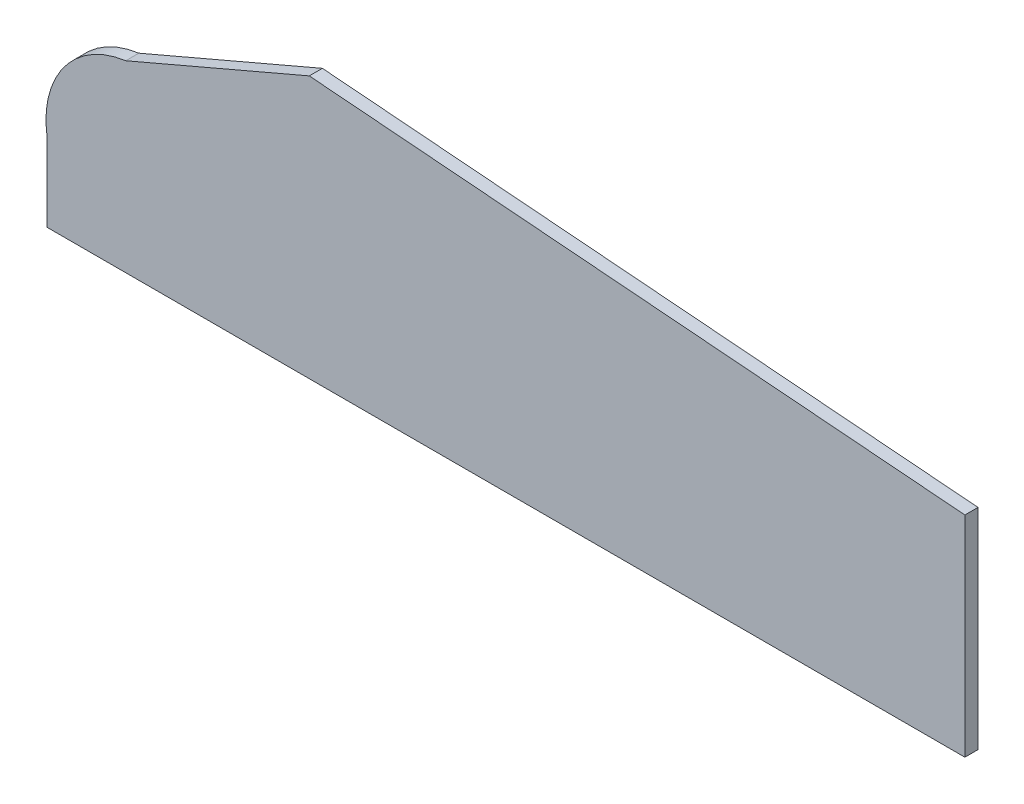
ISO-10303-21;
HEADER;
FILE_DESCRIPTION(('STEP AP214'),'2;1');
FILE_NAME('part.step','',(''),(''),'','','');
FILE_SCHEMA(('AUTOMOTIVE_DESIGN { 1 0 10303 214 1 1 1 1 }'));
ENDSEC;
DATA;
#1=APPLICATION_CONTEXT('core data for automotive mechanical design processes');
#2=APPLICATION_PROTOCOL_DEFINITION('international standard','automotive_design',2000,#1);
#3=PRODUCT_CONTEXT('',#1,'mechanical');
#4=PRODUCT('Part','Part','',(#3));
#5=PRODUCT_RELATED_PRODUCT_CATEGORY('part','',(#4));
#6=PRODUCT_DEFINITION_FORMATION('','',#4);
#7=PRODUCT_DEFINITION_CONTEXT('part definition',#1,'design');
#8=PRODUCT_DEFINITION('design','',#6,#7);
#9=PRODUCT_DEFINITION_SHAPE('','',#8);
#10=(LENGTH_UNIT() NAMED_UNIT(*) SI_UNIT(.MILLI.,.METRE.));
#11=(NAMED_UNIT(*) PLANE_ANGLE_UNIT() SI_UNIT($,.RADIAN.));
#12=(NAMED_UNIT(*) SI_UNIT($,.STERADIAN.) SOLID_ANGLE_UNIT());
#13=UNCERTAINTY_MEASURE_WITH_UNIT(LENGTH_MEASURE(1.E-05),#10,'distance_accuracy_value','');
#14=(GEOMETRIC_REPRESENTATION_CONTEXT(3) GLOBAL_UNCERTAINTY_ASSIGNED_CONTEXT((#13)) GLOBAL_UNIT_ASSIGNED_CONTEXT((#10,
#11,#12)) REPRESENTATION_CONTEXT('',''));
#15=CARTESIAN_POINT('',(0.,0.,0.));
#16=DIRECTION('',(0.,0.,1.));
#17=DIRECTION('',(1.,0.,0.));
#18=AXIS2_PLACEMENT_3D('',#15,#16,#17);
#19=CARTESIAN_POINT('',(0.,0.,5.));
#20=DIRECTION('',(1.,0.,0.));
#21=DIRECTION('',(0.,0.,-1.));
#22=AXIS2_PLACEMENT_3D('',#19,#20,#21);
#23=PLANE('',#22);
#24=DIRECTION('',(0.,-1.,0.));
#25=VECTOR('',#24,1.);
#26=CARTESIAN_POINT('',(0.,0.,0.));
#27=LINE('',#26,#25);
#28=CARTESIAN_POINT('',(0.,30.,0.));
#29=VERTEX_POINT('',#28);
#30=CARTESIAN_POINT('',(0.,0.,0.));
#31=VERTEX_POINT('',#30);
#32=EDGE_CURVE('E132',#29,#31,#27,.T.);
#33=ORIENTED_EDGE('',*,*,#32,.T.);
#34=DIRECTION('',(0.,0.,-1.));
#35=VECTOR('',#34,1.);
#36=CARTESIAN_POINT('',(0.,0.,5.));
#37=LINE('',#36,#35);
#38=CARTESIAN_POINT('',(0.,0.,5.));
#39=VERTEX_POINT('',#38);
#40=EDGE_CURVE('E11',#39,#31,#37,.T.);
#41=ORIENTED_EDGE('',*,*,#40,.F.);
#42=DIRECTION('',(0.,-1.,0.));
#43=VECTOR('',#42,1.);
#44=CARTESIAN_POINT('',(0.,0.,5.));
#45=LINE('',#44,#43);
#46=CARTESIAN_POINT('',(0.,30.,5.));
#47=VERTEX_POINT('',#46);
#48=EDGE_CURVE('E148',#47,#39,#45,.T.);
#49=ORIENTED_EDGE('',*,*,#48,.F.);
#50=DIRECTION('',(0.,0.,-1.));
#51=VECTOR('',#50,1.);
#52=CARTESIAN_POINT('',(0.,30.,5.));
#53=LINE('',#52,#51);
#54=EDGE_CURVE('E128',#47,#29,#53,.T.);
#55=ORIENTED_EDGE('',*,*,#54,.T.);
#56=EDGE_LOOP('',(#33,#41,#49,#55));
#57=FACE_BOUND('',#56,.T.);
#58=ADVANCED_FACE('F41',(#57),#23,.F.);
#59=CARTESIAN_POINT('',(0.,0.,5.));
#60=DIRECTION('',(0.,1.,0.));
#61=DIRECTION('',(0.,0.,1.));
#62=AXIS2_PLACEMENT_3D('',#59,#60,#61);
#63=PLANE('',#62);
#64=DIRECTION('',(1.,0.,0.));
#65=VECTOR('',#64,1.);
#66=CARTESIAN_POINT('',(0.,0.,0.));
#67=LINE('',#66,#65);
#68=CARTESIAN_POINT('',(350.,0.,0.));
#69=VERTEX_POINT('',#68);
#70=EDGE_CURVE('E136',#31,#69,#67,.T.);
#71=ORIENTED_EDGE('',*,*,#70,.T.);
#72=DIRECTION('',(0.,0.,-1.));
#73=VECTOR('',#72,1.);
#74=CARTESIAN_POINT('',(350.,0.,5.));
#75=LINE('',#74,#73);
#76=CARTESIAN_POINT('',(350.,0.,5.));
#77=VERTEX_POINT('',#76);
#78=EDGE_CURVE('E50',#77,#69,#75,.T.);
#79=ORIENTED_EDGE('',*,*,#78,.F.);
#80=DIRECTION('',(1.,0.,0.));
#81=VECTOR('',#80,1.);
#82=CARTESIAN_POINT('',(0.,0.,5.));
#83=LINE('',#82,#81);
#84=EDGE_CURVE('E95',#39,#77,#83,.T.);
#85=ORIENTED_EDGE('',*,*,#84,.F.);
#86=ORIENTED_EDGE('',*,*,#40,.T.);
#87=EDGE_LOOP('',(#71,#79,#85,#86));
#88=FACE_BOUND('',#87,.T.);
#89=ADVANCED_FACE('F178',(#88),#63,.F.);
#90=CARTESIAN_POINT('',(350.,0.,5.));
#91=DIRECTION('',(-1.,0.,0.));
#92=DIRECTION('',(0.,0.,1.));
#93=AXIS2_PLACEMENT_3D('',#90,#91,#92);
#94=PLANE('',#93);
#95=DIRECTION('',(0.,1.,0.));
#96=VECTOR('',#95,1.);
#97=CARTESIAN_POINT('',(350.,0.,0.));
#98=LINE('',#97,#96);
#99=CARTESIAN_POINT('',(350.,80.,0.));
#100=VERTEX_POINT('',#99);
#101=EDGE_CURVE('E139',#69,#100,#98,.T.);
#102=ORIENTED_EDGE('',*,*,#101,.T.);
#103=DIRECTION('',(0.,0.,-1.));
#104=VECTOR('',#103,1.);
#105=CARTESIAN_POINT('',(350.,80.,5.));
#106=LINE('',#105,#104);
#107=CARTESIAN_POINT('',(350.,80.,5.));
#108=VERTEX_POINT('',#107);
#109=EDGE_CURVE('E119',#108,#100,#106,.T.);
#110=ORIENTED_EDGE('',*,*,#109,.F.);
#111=DIRECTION('',(0.,1.,0.));
#112=VECTOR('',#111,1.);
#113=CARTESIAN_POINT('',(350.,0.,5.));
#114=LINE('',#113,#112);
#115=EDGE_CURVE('E108',#77,#108,#114,.T.);
#116=ORIENTED_EDGE('',*,*,#115,.F.);
#117=ORIENTED_EDGE('',*,*,#78,.T.);
#118=EDGE_LOOP('',(#102,#110,#116,#117));
#119=FACE_BOUND('',#118,.T.);
#120=ADVANCED_FACE('F160',(#119),#94,.F.);
#121=CARTESIAN_POINT('',(350.,80.,5.));
#122=DIRECTION('',(-0.07974522228289,-0.996815278536125,0.));
#123=DIRECTION('',(0.996815278536125,-0.07974522228289,0.));
#124=AXIS2_PLACEMENT_3D('',#121,#122,#123);
#125=PLANE('',#124);
#126=DIRECTION('',(-0.996815278536125,0.07974522228289,0.));
#127=VECTOR('',#126,1.);
#128=CARTESIAN_POINT('',(350.,80.,0.));
#129=LINE('',#128,#127);
#130=CARTESIAN_POINT('',(100.,100.,0.));
#131=VERTEX_POINT('',#130);
#132=EDGE_CURVE('E117',#100,#131,#129,.T.);
#133=ORIENTED_EDGE('',*,*,#132,.T.);
#134=DIRECTION('',(0.,0.,-1.));
#135=VECTOR('',#134,1.);
#136=CARTESIAN_POINT('',(100.,100.,5.));
#137=LINE('',#136,#135);
#138=CARTESIAN_POINT('',(100.,100.,5.));
#139=VERTEX_POINT('',#138);
#140=EDGE_CURVE('E114',#139,#131,#137,.T.);
#141=ORIENTED_EDGE('',*,*,#140,.F.);
#142=DIRECTION('',(-0.996815278536125,0.07974522228289,0.));
#143=VECTOR('',#142,1.);
#144=CARTESIAN_POINT('',(350.,80.,5.));
#145=LINE('',#144,#143);
#146=EDGE_CURVE('E102',#108,#139,#145,.T.);
#147=ORIENTED_EDGE('',*,*,#146,.F.);
#148=ORIENTED_EDGE('',*,*,#109,.T.);
#149=EDGE_LOOP('',(#133,#141,#147,#148));
#150=FACE_BOUND('',#149,.T.);
#151=ADVANCED_FACE('F115',(#150),#125,.F.);
#152=CARTESIAN_POINT('',(100.,100.,5.));
#153=DIRECTION('',(0.393919298579168,-0.919145030018058,0.));
#154=DIRECTION('',(0.919145030018058,0.393919298579168,0.));
#155=AXIS2_PLACEMENT_3D('',#152,#153,#154);
#156=PLANE('',#155);
#157=DIRECTION('',(-0.919145030018058,-0.393919298579168,0.));
#158=VECTOR('',#157,1.);
#159=CARTESIAN_POINT('',(100.,100.,0.));
#160=LINE('',#159,#158);
#161=CARTESIAN_POINT('',(30.,70.,0.));
#162=VERTEX_POINT('',#161);
#163=EDGE_CURVE('E81',#131,#162,#160,.T.);
#164=ORIENTED_EDGE('',*,*,#163,.T.);
#165=DIRECTION('',(0.,0.,-1.));
#166=VECTOR('',#165,1.);
#167=CARTESIAN_POINT('',(30.,70.,5.));
#168=LINE('',#167,#166);
#169=CARTESIAN_POINT('',(30.,70.,5.));
#170=VERTEX_POINT('',#169);
#171=EDGE_CURVE('E120',#170,#162,#168,.T.);
#172=ORIENTED_EDGE('',*,*,#171,.F.);
#173=DIRECTION('',(-0.919145030018058,-0.393919298579168,0.));
#174=VECTOR('',#173,1.);
#175=CARTESIAN_POINT('',(100.,100.,5.));
#176=LINE('',#175,#174);
#177=EDGE_CURVE('E106',#139,#170,#176,.T.);
#178=ORIENTED_EDGE('',*,*,#177,.F.);
#179=ORIENTED_EDGE('',*,*,#140,.T.);
#180=EDGE_LOOP('',(#164,#172,#178,#179));
#181=FACE_BOUND('',#180,.T.);
#182=ADVANCED_FACE('F122',(#181),#156,.F.);
#183=CARTESIAN_POINT('',(34.5959179422654,35.3030615433009,5.));
#184=DIRECTION('',(0.,0.,-1.));
#185=DIRECTION('',(-1.,0.,0.));
#186=AXIS2_PLACEMENT_3D('',#183,#184,#185);
#187=CYLINDRICAL_SURFACE('',#186,35.);
#188=CARTESIAN_POINT('',(34.5959179422654,35.3030615433009,0.));
#189=DIRECTION('',(0.,0.,1.));
#190=DIRECTION('',(1.,0.,0.));
#191=AXIS2_PLACEMENT_3D('',#188,#189,#190);
#192=CIRCLE('',#191,35.);
#193=EDGE_CURVE('E87',#162,#29,#192,.T.);
#194=ORIENTED_EDGE('',*,*,#193,.T.);
#195=ORIENTED_EDGE('',*,*,#54,.F.);
#196=CARTESIAN_POINT('',(34.5959179422654,35.3030615433009,5.));
#197=DIRECTION('',(0.,0.,1.));
#198=DIRECTION('',(1.,0.,0.));
#199=AXIS2_PLACEMENT_3D('',#196,#197,#198);
#200=CIRCLE('',#199,35.);
#201=EDGE_CURVE('E58',#170,#47,#200,.T.);
#202=ORIENTED_EDGE('',*,*,#201,.F.);
#203=ORIENTED_EDGE('',*,*,#171,.T.);
#204=EDGE_LOOP('',(#194,#195,#202,#203));
#205=FACE_BOUND('',#204,.T.);
#206=ADVANCED_FACE('F167',(#205),#187,.T.);
#207=CARTESIAN_POINT('',(34.5959179422654,35.3030615433009,5.));
#208=DIRECTION('',(0.,0.,1.));
#209=DIRECTION('',(1.,0.,0.));
#210=AXIS2_PLACEMENT_3D('',#207,#208,#209);
#211=PLANE('',#210);
#212=ORIENTED_EDGE('',*,*,#48,.T.);
#213=ORIENTED_EDGE('',*,*,#84,.T.);
#214=ORIENTED_EDGE('',*,*,#115,.T.);
#215=ORIENTED_EDGE('',*,*,#146,.T.);
#216=ORIENTED_EDGE('',*,*,#177,.T.);
#217=ORIENTED_EDGE('',*,*,#201,.T.);
#218=EDGE_LOOP('',(#212,#213,#214,#215,#216,#217));
#219=FACE_BOUND('',#218,.T.);
#220=ADVANCED_FACE('F104',(#219),#211,.T.);
#221=CARTESIAN_POINT('',(34.5959179422654,35.3030615433009,0.));
#222=DIRECTION('',(0.,0.,1.));
#223=DIRECTION('',(1.,0.,0.));
#224=AXIS2_PLACEMENT_3D('',#221,#222,#223);
#225=PLANE('',#224);
#226=ORIENTED_EDGE('',*,*,#32,.F.);
#227=ORIENTED_EDGE('',*,*,#193,.F.);
#228=ORIENTED_EDGE('',*,*,#163,.F.);
#229=ORIENTED_EDGE('',*,*,#132,.F.);
#230=ORIENTED_EDGE('',*,*,#101,.F.);
#231=ORIENTED_EDGE('',*,*,#70,.F.);
#232=EDGE_LOOP('',(#226,#227,#228,#229,#230,#231));
#233=FACE_BOUND('',#232,.T.);
#234=ADVANCED_FACE('F163',(#233),#225,.F.);
#235=CLOSED_SHELL('',(#58,#89,#120,#151,#182,#206,#220,#234));
#236=MANIFOLD_SOLID_BREP('B2',#235);
#237=ADVANCED_BREP_SHAPE_REPRESENTATION('',(#18,#236),#14);
#238=SHAPE_DEFINITION_REPRESENTATION(#9,#237);
ENDSEC;
END-ISO-10303-21;
